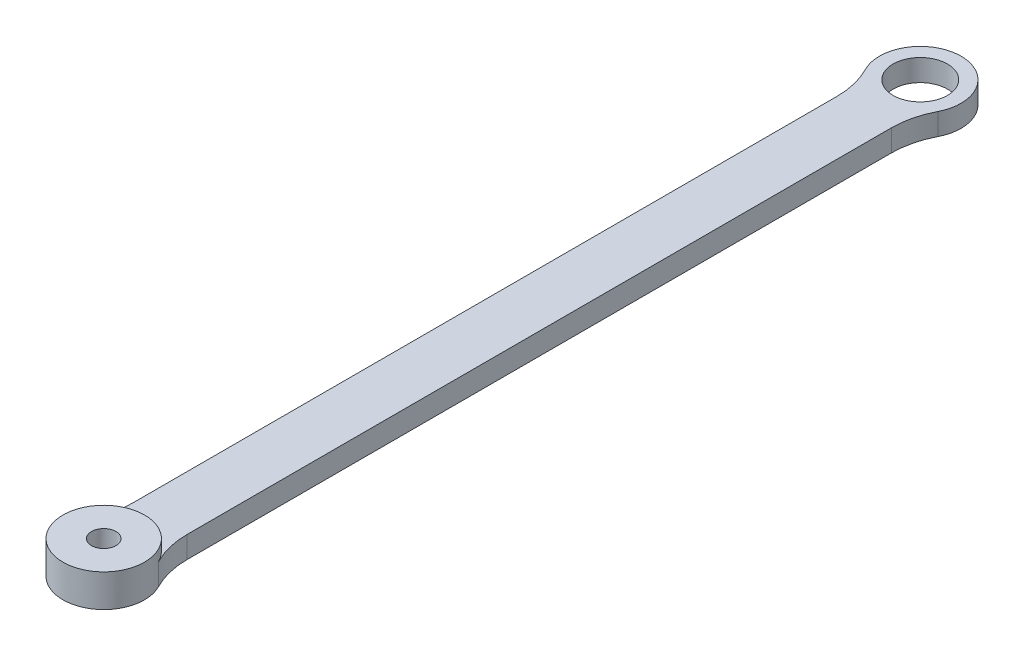
ISO-10303-21;
HEADER;
FILE_DESCRIPTION(('STEP AP214'),'2;1');
FILE_NAME('part.step','',(''),(''),'','','');
FILE_SCHEMA(('AUTOMOTIVE_DESIGN { 1 0 10303 214 1 1 1 1 }'));
ENDSEC;
DATA;
#1=APPLICATION_CONTEXT('core data for automotive mechanical design processes');
#2=APPLICATION_PROTOCOL_DEFINITION('international standard','automotive_design',2000,#1);
#3=PRODUCT_CONTEXT('',#1,'mechanical');
#4=PRODUCT('Part','Part','',(#3));
#5=PRODUCT_RELATED_PRODUCT_CATEGORY('part','',(#4));
#6=PRODUCT_DEFINITION_FORMATION('','',#4);
#7=PRODUCT_DEFINITION_CONTEXT('part definition',#1,'design');
#8=PRODUCT_DEFINITION('design','',#6,#7);
#9=PRODUCT_DEFINITION_SHAPE('','',#8);
#10=(LENGTH_UNIT() NAMED_UNIT(*) SI_UNIT(.MILLI.,.METRE.));
#11=(NAMED_UNIT(*) PLANE_ANGLE_UNIT() SI_UNIT($,.RADIAN.));
#12=(NAMED_UNIT(*) SI_UNIT($,.STERADIAN.) SOLID_ANGLE_UNIT());
#13=UNCERTAINTY_MEASURE_WITH_UNIT(LENGTH_MEASURE(1.E-05),#10,'distance_accuracy_value','');
#14=(GEOMETRIC_REPRESENTATION_CONTEXT(3) GLOBAL_UNCERTAINTY_ASSIGNED_CONTEXT((#13)) GLOBAL_UNIT_ASSIGNED_CONTEXT((#10,
#11,#12)) REPRESENTATION_CONTEXT('',''));
#15=CARTESIAN_POINT('',(0.,0.,0.));
#16=DIRECTION('',(0.,0.,1.));
#17=DIRECTION('',(1.,0.,0.));
#18=AXIS2_PLACEMENT_3D('',#15,#16,#17);
#19=CARTESIAN_POINT('',(0.,4.,75.));
#20=DIRECTION('',(0.,-1.,0.));
#21=DIRECTION('',(0.,0.,-1.));
#22=AXIS2_PLACEMENT_3D('',#19,#20,#21);
#23=CYLINDRICAL_SURFACE('',#22,2.25);
#24=CARTESIAN_POINT('',(0.,0.,75.));
#25=DIRECTION('',(0.,1.,0.));
#26=DIRECTION('',(0.,0.,1.));
#27=AXIS2_PLACEMENT_3D('',#24,#25,#26);
#28=CIRCLE('',#27,2.25);
#29=CARTESIAN_POINT('',(0.,0.,77.25));
#30=VERTEX_POINT('',#29);
#31=EDGE_CURVE('E157',#30,#30,#28,.T.);
#32=ORIENTED_EDGE('',*,*,#31,.F.);
#33=EDGE_LOOP('',(#32));
#34=FACE_BOUND('',#33,.T.);
#35=CARTESIAN_POINT('',(0.,6.,75.));
#36=DIRECTION('',(0.,1.,0.));
#37=DIRECTION('',(0.,0.,1.));
#38=AXIS2_PLACEMENT_3D('',#35,#36,#37);
#39=CIRCLE('',#38,2.25);
#40=CARTESIAN_POINT('',(0.,6.,77.25));
#41=VERTEX_POINT('',#40);
#42=EDGE_CURVE('E146',#41,#41,#39,.T.);
#43=ORIENTED_EDGE('',*,*,#42,.T.);
#44=EDGE_LOOP('',(#43));
#45=FACE_BOUND('',#44,.T.);
#46=ADVANCED_FACE('F58',(#34,#45),#23,.F.);
#47=CARTESIAN_POINT('',(5.,4.,0.));
#48=DIRECTION('',(-1.,0.,0.));
#49=DIRECTION('',(0.,0.,1.));
#50=AXIS2_PLACEMENT_3D('',#47,#48,#49);
#51=PLANE('',#50);
#52=DIRECTION('',(0.,0.,-1.));
#53=VECTOR('',#52,1.);
#54=CARTESIAN_POINT('',(5.,0.,0.));
#55=LINE('',#54,#53);
#56=CARTESIAN_POINT('',(5.,0.,64.6922359359558));
#57=VERTEX_POINT('',#56);
#58=CARTESIAN_POINT('',(5.,0.,-64.6922359359558));
#59=VERTEX_POINT('',#58);
#60=EDGE_CURVE('E162',#57,#59,#55,.T.);
#61=ORIENTED_EDGE('',*,*,#60,.T.);
#62=DIRECTION('',(0.,1.,0.));
#63=VECTOR('',#62,1.);
#64=CARTESIAN_POINT('',(5.,4.,-64.6922359359558));
#65=LINE('',#64,#63);
#66=CARTESIAN_POINT('',(5.,4.,-64.6922359359558));
#67=VERTEX_POINT('',#66);
#68=EDGE_CURVE('E191',#59,#67,#65,.T.);
#69=ORIENTED_EDGE('',*,*,#68,.T.);
#70=DIRECTION('',(0.,0.,-1.));
#71=VECTOR('',#70,1.);
#72=CARTESIAN_POINT('',(5.,4.,0.));
#73=LINE('',#72,#71);
#74=CARTESIAN_POINT('',(5.,4.,64.6922359359558));
#75=VERTEX_POINT('',#74);
#76=EDGE_CURVE('E154',#75,#67,#73,.T.);
#77=ORIENTED_EDGE('',*,*,#76,.F.);
#78=DIRECTION('',(0.,1.,0.));
#79=VECTOR('',#78,1.);
#80=CARTESIAN_POINT('',(5.,0.,64.6922359359558));
#81=LINE('',#80,#79);
#82=EDGE_CURVE('E129',#75,#57,#81,.F.);
#83=ORIENTED_EDGE('',*,*,#82,.T.);
#84=EDGE_LOOP('',(#61,#69,#77,#83));
#85=FACE_BOUND('',#84,.T.);
#86=ADVANCED_FACE('F219',(#85),#51,.F.);
#87=CARTESIAN_POINT('',(-5.,4.,0.));
#88=DIRECTION('',(-1.,0.,0.));
#89=DIRECTION('',(0.,0.,1.));
#90=AXIS2_PLACEMENT_3D('',#87,#88,#89);
#91=PLANE('',#90);
#92=DIRECTION('',(0.,0.,-1.));
#93=VECTOR('',#92,1.);
#94=CARTESIAN_POINT('',(-5.,4.,0.));
#95=LINE('',#94,#93);
#96=CARTESIAN_POINT('',(-5.,4.,64.6922359359558));
#97=VERTEX_POINT('',#96);
#98=CARTESIAN_POINT('',(-5.,4.,-64.6922359359558));
#99=VERTEX_POINT('',#98);
#100=EDGE_CURVE('E156',#97,#99,#95,.T.);
#101=ORIENTED_EDGE('',*,*,#100,.T.);
#102=DIRECTION('',(0.,-1.,0.));
#103=VECTOR('',#102,1.);
#104=CARTESIAN_POINT('',(-5.,4.,-64.6922359359558));
#105=LINE('',#104,#103);
#106=CARTESIAN_POINT('',(-5.,0.,-64.6922359359558));
#107=VERTEX_POINT('',#106);
#108=EDGE_CURVE('E182',#99,#107,#105,.T.);
#109=ORIENTED_EDGE('',*,*,#108,.T.);
#110=DIRECTION('',(0.,0.,-1.));
#111=VECTOR('',#110,1.);
#112=CARTESIAN_POINT('',(-5.,0.,0.));
#113=LINE('',#112,#111);
#114=CARTESIAN_POINT('',(-5.,0.,64.6922359359558));
#115=VERTEX_POINT('',#114);
#116=EDGE_CURVE('E166',#115,#107,#113,.T.);
#117=ORIENTED_EDGE('',*,*,#116,.F.);
#118=DIRECTION('',(0.,-1.,0.));
#119=VECTOR('',#118,1.);
#120=CARTESIAN_POINT('',(-5.,4.,64.6922359359558));
#121=LINE('',#120,#119);
#122=EDGE_CURVE('E160',#115,#97,#121,.F.);
#123=ORIENTED_EDGE('',*,*,#122,.T.);
#124=EDGE_LOOP('',(#101,#109,#117,#123));
#125=FACE_BOUND('',#124,.T.);
#126=ADVANCED_FACE('F207',(#125),#91,.T.);
#127=CARTESIAN_POINT('',(0.,4.,75.));
#128=DIRECTION('',(0.,-1.,0.));
#129=DIRECTION('',(0.,0.,-1.));
#130=AXIS2_PLACEMENT_3D('',#127,#128,#129);
#131=CYLINDRICAL_SURFACE('',#130,7.50000000000001);
#132=CARTESIAN_POINT('',(0.,0.,75.));
#133=DIRECTION('',(0.,1.,0.));
#134=DIRECTION('',(0.,0.,1.));
#135=AXIS2_PLACEMENT_3D('',#132,#133,#134);
#136=CIRCLE('',#135,7.50000000000001);
#137=CARTESIAN_POINT('',(-6.66666666666667,0.,71.5640786453186));
#138=VERTEX_POINT('',#137);
#139=CARTESIAN_POINT('',(6.66666666666667,0.,71.5640786453186));
#140=VERTEX_POINT('',#139);
#141=EDGE_CURVE('E139',#138,#140,#136,.T.);
#142=ORIENTED_EDGE('',*,*,#141,.T.);
#143=DIRECTION('',(0.,-1.,0.));
#144=VECTOR('',#143,1.);
#145=CARTESIAN_POINT('',(6.66666666666667,4.,71.5640786453186));
#146=LINE('',#145,#144);
#147=CARTESIAN_POINT('',(6.66666666666667,4.,71.5640786453186));
#148=VERTEX_POINT('',#147);
#149=EDGE_CURVE('E127',#140,#148,#146,.F.);
#150=ORIENTED_EDGE('',*,*,#149,.T.);
#151=CARTESIAN_POINT('',(0.,4.,75.));
#152=DIRECTION('',(0.,1.,0.));
#153=DIRECTION('',(0.,0.,1.));
#154=AXIS2_PLACEMENT_3D('',#151,#152,#153);
#155=CIRCLE('',#154,7.50000000000001);
#156=CARTESIAN_POINT('',(-6.66666666666667,4.,71.5640786453186));
#157=VERTEX_POINT('',#156);
#158=EDGE_CURVE('E138',#148,#157,#155,.T.);
#159=ORIENTED_EDGE('',*,*,#158,.T.);
#160=DIRECTION('',(0.,-1.,0.));
#161=VECTOR('',#160,1.);
#162=CARTESIAN_POINT('',(-6.66666666666667,4.,71.5640786453186));
#163=LINE('',#162,#161);
#164=EDGE_CURVE('E141',#157,#138,#163,.T.);
#165=ORIENTED_EDGE('',*,*,#164,.T.);
#166=EDGE_LOOP('',(#142,#150,#159,#165));
#167=FACE_BOUND('',#166,.T.);
#168=CARTESIAN_POINT('',(0.,6.,75.));
#169=DIRECTION('',(0.,1.,0.));
#170=DIRECTION('',(0.,0.,1.));
#171=AXIS2_PLACEMENT_3D('',#168,#169,#170);
#172=CIRCLE('',#171,7.50000000000001);
#173=CARTESIAN_POINT('',(0.,6.,82.5));
#174=VERTEX_POINT('',#173);
#175=EDGE_CURVE('E145',#174,#174,#172,.T.);
#176=ORIENTED_EDGE('',*,*,#175,.F.);
#177=EDGE_LOOP('',(#176));
#178=FACE_BOUND('',#177,.T.);
#179=ADVANCED_FACE('F135',(#167,#178),#131,.T.);
#180=CARTESIAN_POINT('',(0.,0.,0.));
#181=DIRECTION('',(0.,1.,0.));
#182=DIRECTION('',(0.,0.,1.));
#183=AXIS2_PLACEMENT_3D('',#180,#181,#182);
#184=PLANE('',#183);
#185=ORIENTED_EDGE('',*,*,#141,.F.);
#186=CARTESIAN_POINT('',(-20.,0.,64.6922359359558));
#187=DIRECTION('',(0.,1.,0.));
#188=DIRECTION('',(0.,0.,1.));
#189=AXIS2_PLACEMENT_3D('',#186,#187,#188);
#190=CIRCLE('',#189,15.);
#191=EDGE_CURVE('E66',#138,#115,#190,.T.);
#192=ORIENTED_EDGE('',*,*,#191,.T.);
#193=ORIENTED_EDGE('',*,*,#116,.T.);
#194=CARTESIAN_POINT('',(-20.,0.,-64.6922359359558));
#195=DIRECTION('',(0.,1.,0.));
#196=DIRECTION('',(0.,0.,1.));
#197=AXIS2_PLACEMENT_3D('',#194,#195,#196);
#198=CIRCLE('',#197,15.);
#199=CARTESIAN_POINT('',(-6.66666666666667,0.,-71.5640786453186));
#200=VERTEX_POINT('',#199);
#201=EDGE_CURVE('E140',#107,#200,#198,.T.);
#202=ORIENTED_EDGE('',*,*,#201,.T.);
#203=CARTESIAN_POINT('',(0.,0.,-75.));
#204=DIRECTION('',(0.,1.,0.));
#205=DIRECTION('',(0.,0.,1.));
#206=AXIS2_PLACEMENT_3D('',#203,#204,#205);
#207=CIRCLE('',#206,7.50000000000001);
#208=CARTESIAN_POINT('',(6.66666666666667,0.,-71.5640786453186));
#209=VERTEX_POINT('',#208);
#210=EDGE_CURVE('E174',#209,#200,#207,.T.);
#211=ORIENTED_EDGE('',*,*,#210,.F.);
#212=CARTESIAN_POINT('',(20.,0.,-64.6922359359558));
#213=DIRECTION('',(0.,1.,0.));
#214=DIRECTION('',(0.,0.,1.));
#215=AXIS2_PLACEMENT_3D('',#212,#213,#214);
#216=CIRCLE('',#215,15.);
#217=EDGE_CURVE('E197',#209,#59,#216,.T.);
#218=ORIENTED_EDGE('',*,*,#217,.T.);
#219=ORIENTED_EDGE('',*,*,#60,.F.);
#220=CARTESIAN_POINT('',(20.,0.,64.6922359359558));
#221=DIRECTION('',(0.,1.,0.));
#222=DIRECTION('',(0.,0.,1.));
#223=AXIS2_PLACEMENT_3D('',#220,#221,#222);
#224=CIRCLE('',#223,15.);
#225=EDGE_CURVE('E79',#57,#140,#224,.T.);
#226=ORIENTED_EDGE('',*,*,#225,.T.);
#227=EDGE_LOOP('',(#185,#192,#193,#202,#211,#218,#219,#226));
#228=FACE_BOUND('',#227,.T.);
#229=ORIENTED_EDGE('',*,*,#31,.T.);
#230=EDGE_LOOP('',(#229));
#231=FACE_BOUND('',#230,.T.);
#232=CARTESIAN_POINT('',(0.,0.,-75.));
#233=DIRECTION('',(0.,1.,0.));
#234=DIRECTION('',(0.,0.,1.));
#235=AXIS2_PLACEMENT_3D('',#232,#233,#234);
#236=CIRCLE('',#235,5.00000000000001);
#237=CARTESIAN_POINT('',(0.,0.,-70.));
#238=VERTEX_POINT('',#237);
#239=EDGE_CURVE('E149',#238,#238,#236,.T.);
#240=ORIENTED_EDGE('',*,*,#239,.T.);
#241=EDGE_LOOP('',(#240));
#242=FACE_BOUND('',#241,.T.);
#243=ADVANCED_FACE('F202',(#228,#231,#242),#184,.F.);
#244=CARTESIAN_POINT('',(0.,4.,0.));
#245=DIRECTION('',(0.,1.,0.));
#246=DIRECTION('',(0.,0.,1.));
#247=AXIS2_PLACEMENT_3D('',#244,#245,#246);
#248=PLANE('',#247);
#249=ORIENTED_EDGE('',*,*,#158,.F.);
#250=CARTESIAN_POINT('',(20.,4.,64.6922359359558));
#251=DIRECTION('',(0.,1.,0.));
#252=DIRECTION('',(0.,0.,1.));
#253=AXIS2_PLACEMENT_3D('',#250,#251,#252);
#254=CIRCLE('',#253,15.);
#255=EDGE_CURVE('E124',#148,#75,#254,.F.);
#256=ORIENTED_EDGE('',*,*,#255,.T.);
#257=ORIENTED_EDGE('',*,*,#76,.T.);
#258=CARTESIAN_POINT('',(20.,4.,-64.6922359359558));
#259=DIRECTION('',(0.,1.,0.));
#260=DIRECTION('',(0.,0.,1.));
#261=AXIS2_PLACEMENT_3D('',#258,#259,#260);
#262=CIRCLE('',#261,15.);
#263=CARTESIAN_POINT('',(6.66666666666667,4.,-71.5640786453186));
#264=VERTEX_POINT('',#263);
#265=EDGE_CURVE('E199',#67,#264,#262,.F.);
#266=ORIENTED_EDGE('',*,*,#265,.T.);
#267=CARTESIAN_POINT('',(0.,4.,-75.));
#268=DIRECTION('',(0.,1.,0.));
#269=DIRECTION('',(0.,0.,1.));
#270=AXIS2_PLACEMENT_3D('',#267,#268,#269);
#271=CIRCLE('',#270,7.50000000000001);
#272=CARTESIAN_POINT('',(-6.66666666666667,4.,-71.5640786453186));
#273=VERTEX_POINT('',#272);
#274=EDGE_CURVE('E163',#264,#273,#271,.T.);
#275=ORIENTED_EDGE('',*,*,#274,.T.);
#276=CARTESIAN_POINT('',(-20.,4.,-64.6922359359558));
#277=DIRECTION('',(0.,1.,0.));
#278=DIRECTION('',(0.,0.,1.));
#279=AXIS2_PLACEMENT_3D('',#276,#277,#278);
#280=CIRCLE('',#279,15.);
#281=EDGE_CURVE('E195',#273,#99,#280,.F.);
#282=ORIENTED_EDGE('',*,*,#281,.T.);
#283=ORIENTED_EDGE('',*,*,#100,.F.);
#284=CARTESIAN_POINT('',(-20.,4.,64.6922359359558));
#285=DIRECTION('',(0.,1.,0.));
#286=DIRECTION('',(0.,0.,1.));
#287=AXIS2_PLACEMENT_3D('',#284,#285,#286);
#288=CIRCLE('',#287,15.);
#289=EDGE_CURVE('E12',#97,#157,#288,.F.);
#290=ORIENTED_EDGE('',*,*,#289,.T.);
#291=EDGE_LOOP('',(#249,#256,#257,#266,#275,#282,#283,#290));
#292=FACE_BOUND('',#291,.T.);
#293=CARTESIAN_POINT('',(0.,4.,-75.));
#294=DIRECTION('',(0.,1.,0.));
#295=DIRECTION('',(0.,0.,1.));
#296=AXIS2_PLACEMENT_3D('',#293,#294,#295);
#297=CIRCLE('',#296,5.00000000000001);
#298=CARTESIAN_POINT('',(0.,4.,-70.));
#299=VERTEX_POINT('',#298);
#300=EDGE_CURVE('E171',#299,#299,#297,.T.);
#301=ORIENTED_EDGE('',*,*,#300,.F.);
#302=EDGE_LOOP('',(#301));
#303=FACE_BOUND('',#302,.T.);
#304=ADVANCED_FACE('F143',(#292,#303),#248,.T.);
#305=CARTESIAN_POINT('',(0.,4.,-75.));
#306=DIRECTION('',(0.,-1.,0.));
#307=DIRECTION('',(0.,0.,-1.));
#308=AXIS2_PLACEMENT_3D('',#305,#306,#307);
#309=CYLINDRICAL_SURFACE('',#308,5.00000000000001);
#310=ORIENTED_EDGE('',*,*,#300,.T.);
#311=EDGE_LOOP('',(#310));
#312=FACE_BOUND('',#311,.T.);
#313=ORIENTED_EDGE('',*,*,#239,.F.);
#314=EDGE_LOOP('',(#313));
#315=FACE_BOUND('',#314,.T.);
#316=ADVANCED_FACE('F236',(#312,#315),#309,.F.);
#317=CARTESIAN_POINT('',(0.,4.,-75.));
#318=DIRECTION('',(0.,-1.,0.));
#319=DIRECTION('',(0.,0.,-1.));
#320=AXIS2_PLACEMENT_3D('',#317,#318,#319);
#321=CYLINDRICAL_SURFACE('',#320,7.50000000000001);
#322=ORIENTED_EDGE('',*,*,#210,.T.);
#323=DIRECTION('',(0.,-1.,0.));
#324=VECTOR('',#323,1.);
#325=CARTESIAN_POINT('',(-6.66666666666667,4.,-71.5640786453186));
#326=LINE('',#325,#324);
#327=EDGE_CURVE('E188',#200,#273,#326,.F.);
#328=ORIENTED_EDGE('',*,*,#327,.T.);
#329=ORIENTED_EDGE('',*,*,#274,.F.);
#330=DIRECTION('',(0.,-1.,0.));
#331=VECTOR('',#330,1.);
#332=CARTESIAN_POINT('',(6.66666666666667,4.,-71.5640786453186));
#333=LINE('',#332,#331);
#334=EDGE_CURVE('E185',#264,#209,#333,.T.);
#335=ORIENTED_EDGE('',*,*,#334,.T.);
#336=EDGE_LOOP('',(#322,#328,#329,#335));
#337=FACE_BOUND('',#336,.T.);
#338=ADVANCED_FACE('F239',(#337),#321,.T.);
#339=CARTESIAN_POINT('',(-20.,4.,-64.6922359359558));
#340=DIRECTION('',(0.,-1.,0.));
#341=DIRECTION('',(0.,0.,-1.));
#342=AXIS2_PLACEMENT_3D('',#339,#340,#341);
#343=CYLINDRICAL_SURFACE('',#342,15.);
#344=ORIENTED_EDGE('',*,*,#281,.F.);
#345=ORIENTED_EDGE('',*,*,#327,.F.);
#346=ORIENTED_EDGE('',*,*,#201,.F.);
#347=ORIENTED_EDGE('',*,*,#108,.F.);
#348=EDGE_LOOP('',(#344,#345,#346,#347));
#349=FACE_BOUND('',#348,.T.);
#350=ADVANCED_FACE('F241',(#349),#343,.F.);
#351=CARTESIAN_POINT('',(20.,4.,-64.6922359359558));
#352=DIRECTION('',(0.,-1.,0.));
#353=DIRECTION('',(0.,0.,-1.));
#354=AXIS2_PLACEMENT_3D('',#351,#352,#353);
#355=CYLINDRICAL_SURFACE('',#354,15.);
#356=ORIENTED_EDGE('',*,*,#265,.F.);
#357=ORIENTED_EDGE('',*,*,#68,.F.);
#358=ORIENTED_EDGE('',*,*,#217,.F.);
#359=ORIENTED_EDGE('',*,*,#334,.F.);
#360=EDGE_LOOP('',(#356,#357,#358,#359));
#361=FACE_BOUND('',#360,.T.);
#362=ADVANCED_FACE('F217',(#361),#355,.F.);
#363=CARTESIAN_POINT('',(20.,4.,64.6922359359558));
#364=DIRECTION('',(0.,-1.,0.));
#365=DIRECTION('',(0.,0.,-1.));
#366=AXIS2_PLACEMENT_3D('',#363,#364,#365);
#367=CYLINDRICAL_SURFACE('',#366,15.);
#368=ORIENTED_EDGE('',*,*,#255,.F.);
#369=ORIENTED_EDGE('',*,*,#149,.F.);
#370=ORIENTED_EDGE('',*,*,#225,.F.);
#371=ORIENTED_EDGE('',*,*,#82,.F.);
#372=EDGE_LOOP('',(#368,#369,#370,#371));
#373=FACE_BOUND('',#372,.T.);
#374=ADVANCED_FACE('F126',(#373),#367,.F.);
#375=CARTESIAN_POINT('',(-20.,4.,64.6922359359558));
#376=DIRECTION('',(0.,-1.,0.));
#377=DIRECTION('',(0.,0.,-1.));
#378=AXIS2_PLACEMENT_3D('',#375,#376,#377);
#379=CYLINDRICAL_SURFACE('',#378,15.);
#380=ORIENTED_EDGE('',*,*,#289,.F.);
#381=ORIENTED_EDGE('',*,*,#122,.F.);
#382=ORIENTED_EDGE('',*,*,#191,.F.);
#383=ORIENTED_EDGE('',*,*,#164,.F.);
#384=EDGE_LOOP('',(#380,#381,#382,#383));
#385=FACE_BOUND('',#384,.T.);
#386=ADVANCED_FACE('F60',(#385),#379,.F.);
#387=CARTESIAN_POINT('',(0.,6.,75.));
#388=DIRECTION('',(0.,1.,0.));
#389=DIRECTION('',(0.,0.,1.));
#390=AXIS2_PLACEMENT_3D('',#387,#388,#389);
#391=PLANE('',#390);
#392=ORIENTED_EDGE('',*,*,#175,.T.);
#393=EDGE_LOOP('',(#392));
#394=FACE_BOUND('',#393,.T.);
#395=ORIENTED_EDGE('',*,*,#42,.F.);
#396=EDGE_LOOP('',(#395));
#397=FACE_BOUND('',#396,.T.);
#398=ADVANCED_FACE('F210',(#394,#397),#391,.T.);
#399=CLOSED_SHELL('',(#46,#86,#126,#179,#243,#304,#316,#338,#350,#362,#374,#386,#398));
#400=MANIFOLD_SOLID_BREP('B2',#399);
#401=ADVANCED_BREP_SHAPE_REPRESENTATION('',(#18,#400),#14);
#402=SHAPE_DEFINITION_REPRESENTATION(#9,#401);
ENDSEC;
END-ISO-10303-21;
